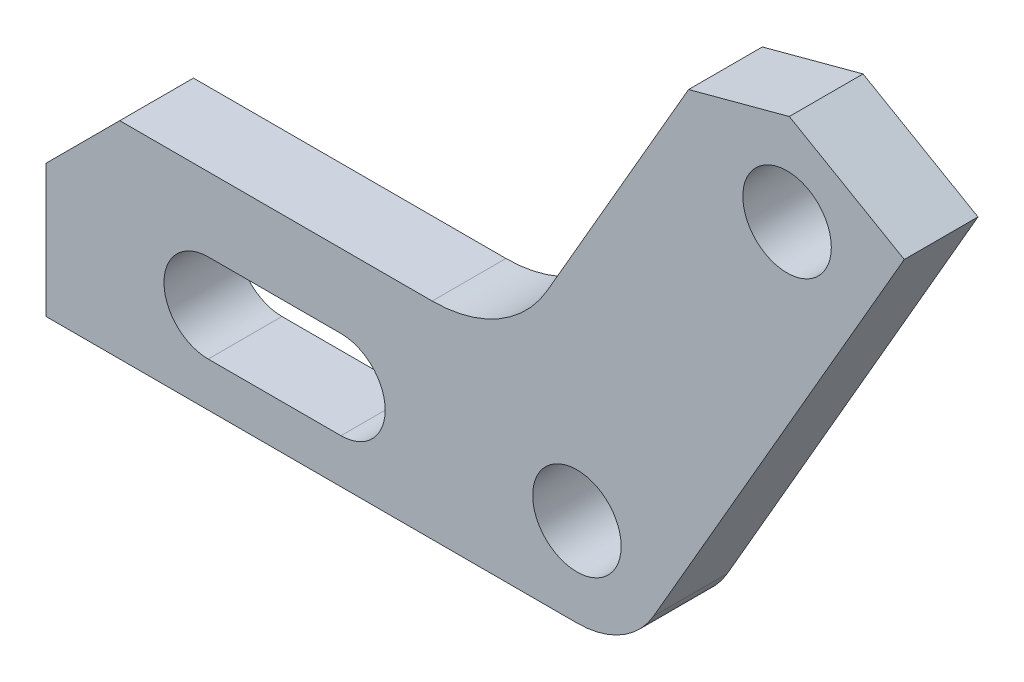
ISO-10303-21;
HEADER;
FILE_DESCRIPTION(('STEP AP214'),'2;1');
FILE_NAME('part.step','',(''),(''),'','','');
FILE_SCHEMA(('AUTOMOTIVE_DESIGN { 1 0 10303 214 1 1 1 1 }'));
ENDSEC;
DATA;
#1=APPLICATION_CONTEXT('core data for automotive mechanical design processes');
#2=APPLICATION_PROTOCOL_DEFINITION('international standard','automotive_design',2000,#1);
#3=PRODUCT_CONTEXT('',#1,'mechanical');
#4=PRODUCT('Part','Part','',(#3));
#5=PRODUCT_RELATED_PRODUCT_CATEGORY('part','',(#4));
#6=PRODUCT_DEFINITION_FORMATION('','',#4);
#7=PRODUCT_DEFINITION_CONTEXT('part definition',#1,'design');
#8=PRODUCT_DEFINITION('design','',#6,#7);
#9=PRODUCT_DEFINITION_SHAPE('','',#8);
#10=(LENGTH_UNIT() NAMED_UNIT(*) SI_UNIT(.MILLI.,.METRE.));
#11=(NAMED_UNIT(*) PLANE_ANGLE_UNIT() SI_UNIT($,.RADIAN.));
#12=(NAMED_UNIT(*) SI_UNIT($,.STERADIAN.) SOLID_ANGLE_UNIT());
#13=UNCERTAINTY_MEASURE_WITH_UNIT(LENGTH_MEASURE(1.E-05),#10,'distance_accuracy_value','');
#14=(GEOMETRIC_REPRESENTATION_CONTEXT(3) GLOBAL_UNCERTAINTY_ASSIGNED_CONTEXT((#13)) GLOBAL_UNIT_ASSIGNED_CONTEXT((#10,
#11,#12)) REPRESENTATION_CONTEXT('',''));
#15=CARTESIAN_POINT('',(0.,0.,0.));
#16=DIRECTION('',(0.,0.,1.));
#17=DIRECTION('',(1.,0.,0.));
#18=AXIS2_PLACEMENT_3D('',#15,#16,#17);
#19=CARTESIAN_POINT('',(0.,0.,10.));
#20=DIRECTION('',(0.,0.,-1.));
#21=DIRECTION('',(-1.,0.,0.));
#22=AXIS2_PLACEMENT_3D('',#19,#20,#21);
#23=PLANE('',#22);
#24=CARTESIAN_POINT('',(28.4999999999999,49.3634480157131,10.));
#25=DIRECTION('',(0.,0.,1.));
#26=DIRECTION('',(1.,0.,0.));
#27=AXIS2_PLACEMENT_3D('',#24,#25,#26);
#28=CIRCLE('',#27,6.);
#29=CARTESIAN_POINT('',(34.4999999999999,49.3634480157131,10.));
#30=VERTEX_POINT('',#29);
#31=EDGE_CURVE('E173',#30,#30,#28,.T.);
#32=ORIENTED_EDGE('',*,*,#31,.F.);
#33=EDGE_LOOP('',(#32));
#34=FACE_BOUND('',#33,.T.);
#35=CARTESIAN_POINT('',(0.,0.,10.));
#36=DIRECTION('',(0.,0.,1.));
#37=DIRECTION('',(1.,0.,0.));
#38=AXIS2_PLACEMENT_3D('',#35,#36,#37);
#39=CIRCLE('',#38,6.);
#40=CARTESIAN_POINT('',(6.,0.,10.));
#41=VERTEX_POINT('',#40);
#42=EDGE_CURVE('E179',#41,#41,#39,.T.);
#43=ORIENTED_EDGE('',*,*,#42,.F.);
#44=EDGE_LOOP('',(#43));
#45=FACE_BOUND('',#44,.T.);
#46=DIRECTION('',(0.499999999999998,0.86602540378444,0.));
#47=VECTOR('',#46,1.);
#48=CARTESIAN_POINT('',(44.3923048454131,52.889727457342,10.));
#49=LINE('',#48,#47);
#50=CARTESIAN_POINT('',(10.3923048454133,-5.99999999999997,10.));
#51=VERTEX_POINT('',#50);
#52=CARTESIAN_POINT('',(44.3923048454131,52.889727457342,10.));
#53=VERTEX_POINT('',#52);
#54=EDGE_CURVE('E185',#51,#53,#49,.T.);
#55=ORIENTED_EDGE('',*,*,#54,.T.);
#56=DIRECTION('',(-0.86602540378444,0.499999999999998,0.));
#57=VECTOR('',#56,1.);
#58=CARTESIAN_POINT('',(28.8038475772932,61.8897274573419,10.));
#59=LINE('',#58,#57);
#60=CARTESIAN_POINT('',(28.8038475772932,61.8897274573419,10.));
#61=VERTEX_POINT('',#60);
#62=EDGE_CURVE('E188',#53,#61,#59,.T.);
#63=ORIENTED_EDGE('',*,*,#62,.T.);
#64=DIRECTION('',(-0.965925826289068,-0.258819045102524,0.));
#65=VECTOR('',#64,1.);
#66=CARTESIAN_POINT('',(15.1435935394488,58.2294734194975,10.));
#67=LINE('',#66,#65);
#68=CARTESIAN_POINT('',(15.1435935394488,58.2294734194975,10.));
#69=VERTEX_POINT('',#68);
#70=EDGE_CURVE('E191',#61,#69,#67,.T.);
#71=ORIENTED_EDGE('',*,*,#70,.T.);
#72=DIRECTION('',(-0.499999999999998,-0.86602540378444,0.));
#73=VECTOR('',#72,1.);
#74=CARTESIAN_POINT('',(-4.04145188432741,25.,10.));
#75=LINE('',#74,#73);
#76=CARTESIAN_POINT('',(-4.04145188432741,25.,10.));
#77=VERTEX_POINT('',#76);
#78=EDGE_CURVE('E193',#69,#77,#75,.T.);
#79=ORIENTED_EDGE('',*,*,#78,.T.);
#80=CARTESIAN_POINT('',(-19.6299091524473,34.,10.));
#81=DIRECTION('',(0.,0.,-1.));
#82=DIRECTION('',(1.,0.,0.));
#83=AXIS2_PLACEMENT_3D('',#80,#81,#82);
#84=CIRCLE('',#83,18.);
#85=CARTESIAN_POINT('',(-19.6299091524473,16.,10.));
#86=VERTEX_POINT('',#85);
#87=EDGE_CURVE('E195',#77,#86,#84,.T.);
#88=ORIENTED_EDGE('',*,*,#87,.T.);
#89=DIRECTION('',(-1.,0.,0.));
#90=VECTOR('',#89,1.);
#91=CARTESIAN_POINT('',(-62.,16.,10.));
#92=LINE('',#91,#90);
#93=CARTESIAN_POINT('',(-62.,16.,10.));
#94=VERTEX_POINT('',#93);
#95=EDGE_CURVE('E197',#86,#94,#92,.T.);
#96=ORIENTED_EDGE('',*,*,#95,.T.);
#97=DIRECTION('',(-0.707106781186548,-0.707106781186547,0.));
#98=VECTOR('',#97,1.);
#99=CARTESIAN_POINT('',(-72.,6.00000000000002,10.));
#100=LINE('',#99,#98);
#101=CARTESIAN_POINT('',(-72.,6.00000000000002,10.));
#102=VERTEX_POINT('',#101);
#103=EDGE_CURVE('E199',#94,#102,#100,.T.);
#104=ORIENTED_EDGE('',*,*,#103,.T.);
#105=DIRECTION('',(0.,-1.,0.));
#106=VECTOR('',#105,1.);
#107=CARTESIAN_POINT('',(-72.,-12.,10.));
#108=LINE('',#107,#106);
#109=CARTESIAN_POINT('',(-72.,-12.,10.));
#110=VERTEX_POINT('',#109);
#111=EDGE_CURVE('E201',#102,#110,#108,.T.);
#112=ORIENTED_EDGE('',*,*,#111,.T.);
#113=DIRECTION('',(1.,0.,0.));
#114=VECTOR('',#113,1.);
#115=CARTESIAN_POINT('',(0.,-12.,10.));
#116=LINE('',#115,#114);
#117=CARTESIAN_POINT('',(0.,-12.,10.));
#118=VERTEX_POINT('',#117);
#119=EDGE_CURVE('E203',#110,#118,#116,.T.);
#120=ORIENTED_EDGE('',*,*,#119,.T.);
#121=CARTESIAN_POINT('',(0.,0.,10.));
#122=DIRECTION('',(0.,0.,1.));
#123=DIRECTION('',(-1.,0.,0.));
#124=AXIS2_PLACEMENT_3D('',#121,#122,#123);
#125=CIRCLE('',#124,12.);
#126=EDGE_CURVE('E205',#118,#51,#125,.T.);
#127=ORIENTED_EDGE('',*,*,#126,.T.);
#128=EDGE_LOOP('',(#55,#63,#71,#79,#88,#96,#104,#112,#120,#127));
#129=FACE_BOUND('',#128,.T.);
#130=CARTESIAN_POINT('',(-32.,0.,10.));
#131=DIRECTION('',(0.,0.,1.));
#132=DIRECTION('',(1.,0.,0.));
#133=AXIS2_PLACEMENT_3D('',#130,#131,#132);
#134=CIRCLE('',#133,6.);
#135=CARTESIAN_POINT('',(-32.,-6.,10.));
#136=VERTEX_POINT('',#135);
#137=CARTESIAN_POINT('',(-32.,6.,10.));
#138=VERTEX_POINT('',#137);
#139=EDGE_CURVE('E137',#136,#138,#134,.T.);
#140=ORIENTED_EDGE('',*,*,#139,.F.);
#141=DIRECTION('',(1.,0.,0.));
#142=VECTOR('',#141,1.);
#143=CARTESIAN_POINT('',(-32.,-6.,10.));
#144=LINE('',#143,#142);
#145=CARTESIAN_POINT('',(-50.,-6.00000000000001,10.));
#146=VERTEX_POINT('',#145);
#147=EDGE_CURVE('E159',#146,#136,#144,.T.);
#148=ORIENTED_EDGE('',*,*,#147,.F.);
#149=CARTESIAN_POINT('',(-50.,0.,10.));
#150=DIRECTION('',(0.,0.,1.));
#151=DIRECTION('',(1.,0.,0.));
#152=AXIS2_PLACEMENT_3D('',#149,#150,#151);
#153=CIRCLE('',#152,6.);
#154=CARTESIAN_POINT('',(-50.,6.,10.));
#155=VERTEX_POINT('',#154);
#156=EDGE_CURVE('E157',#155,#146,#153,.T.);
#157=ORIENTED_EDGE('',*,*,#156,.F.);
#158=DIRECTION('',(-1.,0.,0.));
#159=VECTOR('',#158,1.);
#160=CARTESIAN_POINT('',(-32.,6.,10.));
#161=LINE('',#160,#159);
#162=EDGE_CURVE('E145',#138,#155,#161,.T.);
#163=ORIENTED_EDGE('',*,*,#162,.F.);
#164=EDGE_LOOP('',(#140,#148,#157,#163));
#165=FACE_BOUND('',#164,.T.);
#166=ADVANCED_FACE('F36',(#34,#45,#129,#165),#23,.F.);
#167=CARTESIAN_POINT('',(0.,0.,0.));
#168=DIRECTION('',(0.,0.,-1.));
#169=DIRECTION('',(-1.,0.,0.));
#170=AXIS2_PLACEMENT_3D('',#167,#168,#169);
#171=PLANE('',#170);
#172=CARTESIAN_POINT('',(0.,0.,0.));
#173=DIRECTION('',(0.,0.,1.));
#174=DIRECTION('',(1.,0.,0.));
#175=AXIS2_PLACEMENT_3D('',#172,#173,#174);
#176=CIRCLE('',#175,6.);
#177=CARTESIAN_POINT('',(6.,0.,0.));
#178=VERTEX_POINT('',#177);
#179=EDGE_CURVE('E176',#178,#178,#176,.T.);
#180=ORIENTED_EDGE('',*,*,#179,.T.);
#181=EDGE_LOOP('',(#180));
#182=FACE_BOUND('',#181,.T.);
#183=DIRECTION('',(0.499999999999998,0.86602540378444,0.));
#184=VECTOR('',#183,1.);
#185=CARTESIAN_POINT('',(44.3923048454131,52.889727457342,0.));
#186=LINE('',#185,#184);
#187=CARTESIAN_POINT('',(10.3923048454133,-5.99999999999997,0.));
#188=VERTEX_POINT('',#187);
#189=CARTESIAN_POINT('',(44.3923048454131,52.889727457342,0.));
#190=VERTEX_POINT('',#189);
#191=EDGE_CURVE('E182',#188,#190,#186,.T.);
#192=ORIENTED_EDGE('',*,*,#191,.F.);
#193=CARTESIAN_POINT('',(0.,0.,0.));
#194=DIRECTION('',(0.,0.,1.));
#195=DIRECTION('',(-1.,0.,0.));
#196=AXIS2_PLACEMENT_3D('',#193,#194,#195);
#197=CIRCLE('',#196,12.);
#198=CARTESIAN_POINT('',(0.,-12.,0.));
#199=VERTEX_POINT('',#198);
#200=EDGE_CURVE('E189',#199,#188,#197,.T.);
#201=ORIENTED_EDGE('',*,*,#200,.F.);
#202=DIRECTION('',(1.,0.,0.));
#203=VECTOR('',#202,1.);
#204=CARTESIAN_POINT('',(0.,-12.,0.));
#205=LINE('',#204,#203);
#206=CARTESIAN_POINT('',(-72.,-12.,0.));
#207=VERTEX_POINT('',#206);
#208=EDGE_CURVE('E224',#207,#199,#205,.T.);
#209=ORIENTED_EDGE('',*,*,#208,.F.);
#210=DIRECTION('',(0.,-1.,0.));
#211=VECTOR('',#210,1.);
#212=CARTESIAN_POINT('',(-72.,-12.,0.));
#213=LINE('',#212,#211);
#214=CARTESIAN_POINT('',(-72.,6.00000000000002,0.));
#215=VERTEX_POINT('',#214);
#216=EDGE_CURVE('E222',#215,#207,#213,.T.);
#217=ORIENTED_EDGE('',*,*,#216,.F.);
#218=DIRECTION('',(-0.707106781186548,-0.707106781186547,0.));
#219=VECTOR('',#218,1.);
#220=CARTESIAN_POINT('',(-72.,6.00000000000002,0.));
#221=LINE('',#220,#219);
#222=CARTESIAN_POINT('',(-62.,16.,0.));
#223=VERTEX_POINT('',#222);
#224=EDGE_CURVE('E220',#223,#215,#221,.T.);
#225=ORIENTED_EDGE('',*,*,#224,.F.);
#226=DIRECTION('',(-1.,0.,0.));
#227=VECTOR('',#226,1.);
#228=CARTESIAN_POINT('',(-62.,16.,0.));
#229=LINE('',#228,#227);
#230=CARTESIAN_POINT('',(-19.6299091524473,16.,0.));
#231=VERTEX_POINT('',#230);
#232=EDGE_CURVE('E218',#231,#223,#229,.T.);
#233=ORIENTED_EDGE('',*,*,#232,.F.);
#234=CARTESIAN_POINT('',(-19.6299091524473,34.,0.));
#235=DIRECTION('',(0.,0.,-1.));
#236=DIRECTION('',(1.,0.,0.));
#237=AXIS2_PLACEMENT_3D('',#234,#235,#236);
#238=CIRCLE('',#237,18.);
#239=CARTESIAN_POINT('',(-4.04145188432741,25.,0.));
#240=VERTEX_POINT('',#239);
#241=EDGE_CURVE('E216',#240,#231,#238,.T.);
#242=ORIENTED_EDGE('',*,*,#241,.F.);
#243=DIRECTION('',(-0.499999999999998,-0.86602540378444,0.));
#244=VECTOR('',#243,1.);
#245=CARTESIAN_POINT('',(-4.04145188432741,25.,0.));
#246=LINE('',#245,#244);
#247=CARTESIAN_POINT('',(15.1435935394488,58.2294734194975,0.));
#248=VERTEX_POINT('',#247);
#249=EDGE_CURVE('E214',#248,#240,#246,.T.);
#250=ORIENTED_EDGE('',*,*,#249,.F.);
#251=DIRECTION('',(-0.965925826289068,-0.258819045102524,0.));
#252=VECTOR('',#251,1.);
#253=CARTESIAN_POINT('',(15.1435935394488,58.2294734194975,0.));
#254=LINE('',#253,#252);
#255=CARTESIAN_POINT('',(28.8038475772932,61.8897274573419,0.));
#256=VERTEX_POINT('',#255);
#257=EDGE_CURVE('E212',#256,#248,#254,.T.);
#258=ORIENTED_EDGE('',*,*,#257,.F.);
#259=DIRECTION('',(-0.86602540378444,0.499999999999998,0.));
#260=VECTOR('',#259,1.);
#261=CARTESIAN_POINT('',(28.8038475772932,61.8897274573419,0.));
#262=LINE('',#261,#260);
#263=EDGE_CURVE('E210',#190,#256,#262,.T.);
#264=ORIENTED_EDGE('',*,*,#263,.F.);
#265=EDGE_LOOP('',(#192,#201,#209,#217,#225,#233,#242,#250,#258,#264));
#266=FACE_BOUND('',#265,.T.);
#267=CARTESIAN_POINT('',(28.4999999999999,49.3634480157131,0.));
#268=DIRECTION('',(0.,0.,1.));
#269=DIRECTION('',(1.,0.,0.));
#270=AXIS2_PLACEMENT_3D('',#267,#268,#269);
#271=CIRCLE('',#270,6.);
#272=CARTESIAN_POINT('',(34.4999999999999,49.3634480157131,0.));
#273=VERTEX_POINT('',#272);
#274=EDGE_CURVE('E153',#273,#273,#271,.T.);
#275=ORIENTED_EDGE('',*,*,#274,.T.);
#276=EDGE_LOOP('',(#275));
#277=FACE_BOUND('',#276,.T.);
#278=DIRECTION('',(1.,0.,0.));
#279=VECTOR('',#278,1.);
#280=CARTESIAN_POINT('',(-32.,-6.,0.));
#281=LINE('',#280,#279);
#282=CARTESIAN_POINT('',(-50.,-6.00000000000001,0.));
#283=VERTEX_POINT('',#282);
#284=CARTESIAN_POINT('',(-32.,-6.,0.));
#285=VERTEX_POINT('',#284);
#286=EDGE_CURVE('E146',#283,#285,#281,.T.);
#287=ORIENTED_EDGE('',*,*,#286,.T.);
#288=CARTESIAN_POINT('',(-32.,0.,0.));
#289=DIRECTION('',(0.,0.,1.));
#290=DIRECTION('',(1.,0.,0.));
#291=AXIS2_PLACEMENT_3D('',#288,#289,#290);
#292=CIRCLE('',#291,6.);
#293=CARTESIAN_POINT('',(-32.,6.,0.));
#294=VERTEX_POINT('',#293);
#295=EDGE_CURVE('E59',#285,#294,#292,.T.);
#296=ORIENTED_EDGE('',*,*,#295,.T.);
#297=DIRECTION('',(-1.,0.,0.));
#298=VECTOR('',#297,1.);
#299=CARTESIAN_POINT('',(-32.,6.,0.));
#300=LINE('',#299,#298);
#301=CARTESIAN_POINT('',(-50.,6.,0.));
#302=VERTEX_POINT('',#301);
#303=EDGE_CURVE('E152',#294,#302,#300,.T.);
#304=ORIENTED_EDGE('',*,*,#303,.T.);
#305=CARTESIAN_POINT('',(-50.,0.,0.));
#306=DIRECTION('',(0.,0.,1.));
#307=DIRECTION('',(1.,0.,0.));
#308=AXIS2_PLACEMENT_3D('',#305,#306,#307);
#309=CIRCLE('',#308,6.);
#310=EDGE_CURVE('E165',#302,#283,#309,.T.);
#311=ORIENTED_EDGE('',*,*,#310,.T.);
#312=EDGE_LOOP('',(#287,#296,#304,#311));
#313=FACE_BOUND('',#312,.T.);
#314=ADVANCED_FACE('F260',(#182,#266,#277,#313),#171,.T.);
#315=CARTESIAN_POINT('',(44.3923048454131,52.889727457342,10.));
#316=DIRECTION('',(-0.86602540378444,0.499999999999998,0.));
#317=DIRECTION('',(-0.499999999999998,-0.86602540378444,0.));
#318=AXIS2_PLACEMENT_3D('',#315,#316,#317);
#319=PLANE('',#318);
#320=ORIENTED_EDGE('',*,*,#191,.T.);
#321=DIRECTION('',(0.,0.,-1.));
#322=VECTOR('',#321,1.);
#323=CARTESIAN_POINT('',(44.3923048454131,52.889727457342,10.));
#324=LINE('',#323,#322);
#325=EDGE_CURVE('E11',#53,#190,#324,.T.);
#326=ORIENTED_EDGE('',*,*,#325,.F.);
#327=ORIENTED_EDGE('',*,*,#54,.F.);
#328=DIRECTION('',(0.,0.,-1.));
#329=VECTOR('',#328,1.);
#330=CARTESIAN_POINT('',(10.3923048454133,-5.99999999999997,10.));
#331=LINE('',#330,#329);
#332=EDGE_CURVE('E207',#51,#188,#331,.T.);
#333=ORIENTED_EDGE('',*,*,#332,.T.);
#334=EDGE_LOOP('',(#320,#326,#327,#333));
#335=FACE_BOUND('',#334,.T.);
#336=ADVANCED_FACE('F38',(#335),#319,.F.);
#337=CARTESIAN_POINT('',(28.8038475772932,61.8897274573419,10.));
#338=DIRECTION('',(-0.499999999999998,-0.86602540378444,0.));
#339=DIRECTION('',(0.86602540378444,-0.499999999999998,0.));
#340=AXIS2_PLACEMENT_3D('',#337,#338,#339);
#341=PLANE('',#340);
#342=ORIENTED_EDGE('',*,*,#263,.T.);
#343=DIRECTION('',(0.,0.,-1.));
#344=VECTOR('',#343,1.);
#345=CARTESIAN_POINT('',(28.8038475772932,61.8897274573419,10.));
#346=LINE('',#345,#344);
#347=EDGE_CURVE('E44',#61,#256,#346,.T.);
#348=ORIENTED_EDGE('',*,*,#347,.F.);
#349=ORIENTED_EDGE('',*,*,#62,.F.);
#350=ORIENTED_EDGE('',*,*,#325,.T.);
#351=EDGE_LOOP('',(#342,#348,#349,#350));
#352=FACE_BOUND('',#351,.T.);
#353=ADVANCED_FACE('F277',(#352),#341,.F.);
#354=CARTESIAN_POINT('',(15.1435935394488,58.2294734194975,10.));
#355=DIRECTION('',(0.258819045102524,-0.965925826289068,0.));
#356=DIRECTION('',(0.965925826289068,0.258819045102524,0.));
#357=AXIS2_PLACEMENT_3D('',#354,#355,#356);
#358=PLANE('',#357);
#359=ORIENTED_EDGE('',*,*,#257,.T.);
#360=DIRECTION('',(0.,0.,-1.));
#361=VECTOR('',#360,1.);
#362=CARTESIAN_POINT('',(15.1435935394488,58.2294734194975,10.));
#363=LINE('',#362,#361);
#364=EDGE_CURVE('E247',#69,#248,#363,.T.);
#365=ORIENTED_EDGE('',*,*,#364,.F.);
#366=ORIENTED_EDGE('',*,*,#70,.F.);
#367=ORIENTED_EDGE('',*,*,#347,.T.);
#368=EDGE_LOOP('',(#359,#365,#366,#367));
#369=FACE_BOUND('',#368,.T.);
#370=ADVANCED_FACE('F254',(#369),#358,.F.);
#371=CARTESIAN_POINT('',(-4.04145188432741,25.,10.));
#372=DIRECTION('',(0.86602540378444,-0.499999999999998,0.));
#373=DIRECTION('',(0.499999999999998,0.86602540378444,0.));
#374=AXIS2_PLACEMENT_3D('',#371,#372,#373);
#375=PLANE('',#374);
#376=ORIENTED_EDGE('',*,*,#249,.T.);
#377=DIRECTION('',(0.,0.,-1.));
#378=VECTOR('',#377,1.);
#379=CARTESIAN_POINT('',(-4.04145188432741,25.,10.));
#380=LINE('',#379,#378);
#381=EDGE_CURVE('E244',#77,#240,#380,.T.);
#382=ORIENTED_EDGE('',*,*,#381,.F.);
#383=ORIENTED_EDGE('',*,*,#78,.F.);
#384=ORIENTED_EDGE('',*,*,#364,.T.);
#385=EDGE_LOOP('',(#376,#382,#383,#384));
#386=FACE_BOUND('',#385,.T.);
#387=ADVANCED_FACE('F266',(#386),#375,.F.);
#388=CARTESIAN_POINT('',(-19.6299091524473,34.,10.));
#389=DIRECTION('',(0.,0.,-1.));
#390=DIRECTION('',(-1.,0.,0.));
#391=AXIS2_PLACEMENT_3D('',#388,#389,#390);
#392=CYLINDRICAL_SURFACE('',#391,18.);
#393=ORIENTED_EDGE('',*,*,#241,.T.);
#394=DIRECTION('',(0.,0.,-1.));
#395=VECTOR('',#394,1.);
#396=CARTESIAN_POINT('',(-19.6299091524473,16.,10.));
#397=LINE('',#396,#395);
#398=EDGE_CURVE('E241',#86,#231,#397,.T.);
#399=ORIENTED_EDGE('',*,*,#398,.F.);
#400=ORIENTED_EDGE('',*,*,#87,.F.);
#401=ORIENTED_EDGE('',*,*,#381,.T.);
#402=EDGE_LOOP('',(#393,#399,#400,#401));
#403=FACE_BOUND('',#402,.T.);
#404=ADVANCED_FACE('F270',(#403),#392,.F.);
#405=CARTESIAN_POINT('',(-62.,16.,10.));
#406=DIRECTION('',(0.,-1.,0.));
#407=DIRECTION('',(1.,0.,0.));
#408=AXIS2_PLACEMENT_3D('',#405,#406,#407);
#409=PLANE('',#408);
#410=ORIENTED_EDGE('',*,*,#232,.T.);
#411=DIRECTION('',(0.,0.,-1.));
#412=VECTOR('',#411,1.);
#413=CARTESIAN_POINT('',(-62.,16.,10.));
#414=LINE('',#413,#412);
#415=EDGE_CURVE('E238',#94,#223,#414,.T.);
#416=ORIENTED_EDGE('',*,*,#415,.F.);
#417=ORIENTED_EDGE('',*,*,#95,.F.);
#418=ORIENTED_EDGE('',*,*,#398,.T.);
#419=EDGE_LOOP('',(#410,#416,#417,#418));
#420=FACE_BOUND('',#419,.T.);
#421=ADVANCED_FACE('F300',(#420),#409,.F.);
#422=CARTESIAN_POINT('',(-72.,6.00000000000002,10.));
#423=DIRECTION('',(0.707106781186547,-0.707106781186548,0.));
#424=DIRECTION('',(0.707106781186548,0.707106781186547,0.));
#425=AXIS2_PLACEMENT_3D('',#422,#423,#424);
#426=PLANE('',#425);
#427=ORIENTED_EDGE('',*,*,#224,.T.);
#428=DIRECTION('',(0.,0.,-1.));
#429=VECTOR('',#428,1.);
#430=CARTESIAN_POINT('',(-72.,6.00000000000002,10.));
#431=LINE('',#430,#429);
#432=EDGE_CURVE('E235',#102,#215,#431,.T.);
#433=ORIENTED_EDGE('',*,*,#432,.F.);
#434=ORIENTED_EDGE('',*,*,#103,.F.);
#435=ORIENTED_EDGE('',*,*,#415,.T.);
#436=EDGE_LOOP('',(#427,#433,#434,#435));
#437=FACE_BOUND('',#436,.T.);
#438=ADVANCED_FACE('F297',(#437),#426,.F.);
#439=CARTESIAN_POINT('',(-72.,-12.,10.));
#440=DIRECTION('',(1.,0.,0.));
#441=DIRECTION('',(0.,0.,-1.));
#442=AXIS2_PLACEMENT_3D('',#439,#440,#441);
#443=PLANE('',#442);
#444=ORIENTED_EDGE('',*,*,#216,.T.);
#445=DIRECTION('',(0.,0.,-1.));
#446=VECTOR('',#445,1.);
#447=CARTESIAN_POINT('',(-72.,-12.,10.));
#448=LINE('',#447,#446);
#449=EDGE_CURVE('E232',#110,#207,#448,.T.);
#450=ORIENTED_EDGE('',*,*,#449,.F.);
#451=ORIENTED_EDGE('',*,*,#111,.F.);
#452=ORIENTED_EDGE('',*,*,#432,.T.);
#453=EDGE_LOOP('',(#444,#450,#451,#452));
#454=FACE_BOUND('',#453,.T.);
#455=ADVANCED_FACE('F293',(#454),#443,.F.);
#456=CARTESIAN_POINT('',(0.,-12.,10.));
#457=DIRECTION('',(0.,1.,0.));
#458=DIRECTION('',(-1.,0.,0.));
#459=AXIS2_PLACEMENT_3D('',#456,#457,#458);
#460=PLANE('',#459);
#461=ORIENTED_EDGE('',*,*,#208,.T.);
#462=DIRECTION('',(0.,0.,-1.));
#463=VECTOR('',#462,1.);
#464=CARTESIAN_POINT('',(0.,-12.,10.));
#465=LINE('',#464,#463);
#466=EDGE_CURVE('E229',#118,#199,#465,.T.);
#467=ORIENTED_EDGE('',*,*,#466,.F.);
#468=ORIENTED_EDGE('',*,*,#119,.F.);
#469=ORIENTED_EDGE('',*,*,#449,.T.);
#470=EDGE_LOOP('',(#461,#467,#468,#469));
#471=FACE_BOUND('',#470,.T.);
#472=ADVANCED_FACE('F289',(#471),#460,.F.);
#473=CARTESIAN_POINT('',(0.,0.,10.));
#474=DIRECTION('',(0.,0.,-1.));
#475=DIRECTION('',(-1.,0.,0.));
#476=AXIS2_PLACEMENT_3D('',#473,#474,#475);
#477=CYLINDRICAL_SURFACE('',#476,12.);
#478=ORIENTED_EDGE('',*,*,#200,.T.);
#479=ORIENTED_EDGE('',*,*,#332,.F.);
#480=ORIENTED_EDGE('',*,*,#126,.F.);
#481=ORIENTED_EDGE('',*,*,#466,.T.);
#482=EDGE_LOOP('',(#478,#479,#480,#481));
#483=FACE_BOUND('',#482,.T.);
#484=ADVANCED_FACE('F284',(#483),#477,.T.);
#485=CARTESIAN_POINT('',(0.,0.,10.));
#486=DIRECTION('',(0.,0.,-1.));
#487=DIRECTION('',(-1.,0.,0.));
#488=AXIS2_PLACEMENT_3D('',#485,#486,#487);
#489=CYLINDRICAL_SURFACE('',#488,6.);
#490=ORIENTED_EDGE('',*,*,#42,.T.);
#491=EDGE_LOOP('',(#490));
#492=FACE_BOUND('',#491,.T.);
#493=ORIENTED_EDGE('',*,*,#179,.F.);
#494=EDGE_LOOP('',(#493));
#495=FACE_BOUND('',#494,.T.);
#496=ADVANCED_FACE('F320',(#492,#495),#489,.F.);
#497=CARTESIAN_POINT('',(28.4999999999999,49.3634480157131,10.));
#498=DIRECTION('',(0.,0.,-1.));
#499=DIRECTION('',(-1.,0.,0.));
#500=AXIS2_PLACEMENT_3D('',#497,#498,#499);
#501=CYLINDRICAL_SURFACE('',#500,6.);
#502=ORIENTED_EDGE('',*,*,#31,.T.);
#503=EDGE_LOOP('',(#502));
#504=FACE_BOUND('',#503,.T.);
#505=ORIENTED_EDGE('',*,*,#274,.F.);
#506=EDGE_LOOP('',(#505));
#507=FACE_BOUND('',#506,.T.);
#508=ADVANCED_FACE('F346',(#504,#507),#501,.F.);
#509=CARTESIAN_POINT('',(-32.,0.,10.));
#510=DIRECTION('',(0.,0.,-1.));
#511=DIRECTION('',(-1.,0.,0.));
#512=AXIS2_PLACEMENT_3D('',#509,#510,#511);
#513=CYLINDRICAL_SURFACE('',#512,6.);
#514=ORIENTED_EDGE('',*,*,#295,.F.);
#515=DIRECTION('',(0.,0.,-1.));
#516=VECTOR('',#515,1.);
#517=CARTESIAN_POINT('',(-32.,-6.,10.));
#518=LINE('',#517,#516);
#519=EDGE_CURVE('E141',#136,#285,#518,.T.);
#520=ORIENTED_EDGE('',*,*,#519,.F.);
#521=ORIENTED_EDGE('',*,*,#139,.T.);
#522=DIRECTION('',(0.,0.,-1.));
#523=VECTOR('',#522,1.);
#524=CARTESIAN_POINT('',(-32.,6.,10.));
#525=LINE('',#524,#523);
#526=EDGE_CURVE('E140',#138,#294,#525,.T.);
#527=ORIENTED_EDGE('',*,*,#526,.T.);
#528=EDGE_LOOP('',(#514,#520,#521,#527));
#529=FACE_BOUND('',#528,.T.);
#530=ADVANCED_FACE('F139',(#529),#513,.F.);
#531=CARTESIAN_POINT('',(-32.,6.,10.));
#532=DIRECTION('',(0.,-1.,0.));
#533=DIRECTION('',(1.,0.,0.));
#534=AXIS2_PLACEMENT_3D('',#531,#532,#533);
#535=PLANE('',#534);
#536=ORIENTED_EDGE('',*,*,#303,.F.);
#537=ORIENTED_EDGE('',*,*,#526,.F.);
#538=ORIENTED_EDGE('',*,*,#162,.T.);
#539=DIRECTION('',(0.,0.,-1.));
#540=VECTOR('',#539,1.);
#541=CARTESIAN_POINT('',(-50.,6.,10.));
#542=LINE('',#541,#540);
#543=EDGE_CURVE('E154',#155,#302,#542,.T.);
#544=ORIENTED_EDGE('',*,*,#543,.T.);
#545=EDGE_LOOP('',(#536,#537,#538,#544));
#546=FACE_BOUND('',#545,.T.);
#547=ADVANCED_FACE('F149',(#546),#535,.T.);
#548=CARTESIAN_POINT('',(-50.,0.,10.));
#549=DIRECTION('',(0.,0.,-1.));
#550=DIRECTION('',(-1.,0.,0.));
#551=AXIS2_PLACEMENT_3D('',#548,#549,#550);
#552=CYLINDRICAL_SURFACE('',#551,6.);
#553=ORIENTED_EDGE('',*,*,#310,.F.);
#554=ORIENTED_EDGE('',*,*,#543,.F.);
#555=ORIENTED_EDGE('',*,*,#156,.T.);
#556=DIRECTION('',(0.,0.,-1.));
#557=VECTOR('',#556,1.);
#558=CARTESIAN_POINT('',(-50.,-6.00000000000001,10.));
#559=LINE('',#558,#557);
#560=EDGE_CURVE('E51',#146,#283,#559,.T.);
#561=ORIENTED_EDGE('',*,*,#560,.T.);
#562=EDGE_LOOP('',(#553,#554,#555,#561));
#563=FACE_BOUND('',#562,.T.);
#564=ADVANCED_FACE('F365',(#563),#552,.F.);
#565=CARTESIAN_POINT('',(-32.,-6.,10.));
#566=DIRECTION('',(0.,1.,0.));
#567=DIRECTION('',(-1.,0.,0.));
#568=AXIS2_PLACEMENT_3D('',#565,#566,#567);
#569=PLANE('',#568);
#570=ORIENTED_EDGE('',*,*,#286,.F.);
#571=ORIENTED_EDGE('',*,*,#560,.F.);
#572=ORIENTED_EDGE('',*,*,#147,.T.);
#573=ORIENTED_EDGE('',*,*,#519,.T.);
#574=EDGE_LOOP('',(#570,#571,#572,#573));
#575=FACE_BOUND('',#574,.T.);
#576=ADVANCED_FACE('F372',(#575),#569,.T.);
#577=CLOSED_SHELL('',(#166,#314,#336,#353,#370,#387,#404,#421,#438,#455,#472,#484,#496,#508,
#530,#547,#564,#576));
#578=MANIFOLD_SOLID_BREP('B2',#577);
#579=ADVANCED_BREP_SHAPE_REPRESENTATION('',(#18,#578),#14);
#580=SHAPE_DEFINITION_REPRESENTATION(#9,#579);
ENDSEC;
END-ISO-10303-21;
